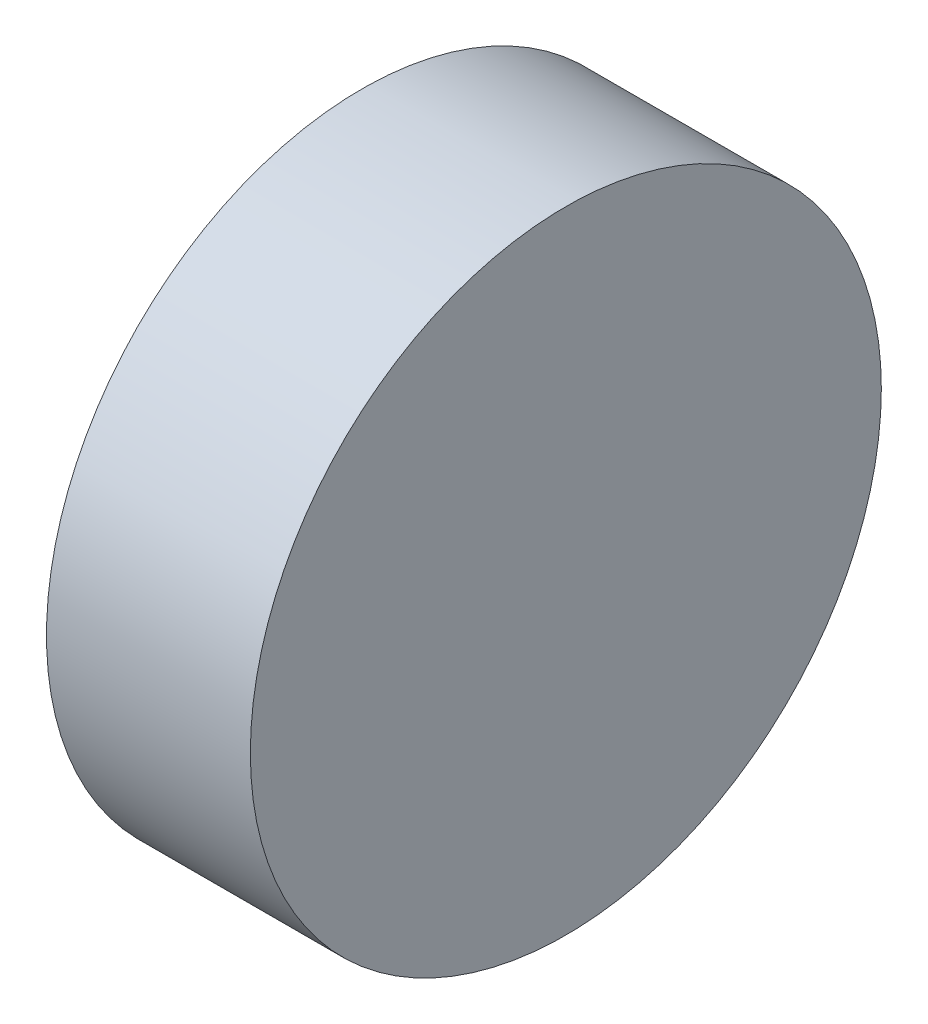
ISO-10303-21;
HEADER;
FILE_DESCRIPTION(('STEP AP214'),'2;1');
FILE_NAME('part.step','',(''),(''),'','','');
FILE_SCHEMA(('AUTOMOTIVE_DESIGN { 1 0 10303 214 1 1 1 1 }'));
ENDSEC;
DATA;
#1=APPLICATION_CONTEXT('core data for automotive mechanical design processes');
#2=APPLICATION_PROTOCOL_DEFINITION('international standard','automotive_design',2000,#1);
#3=PRODUCT_CONTEXT('',#1,'mechanical');
#4=PRODUCT('Part','Part','',(#3));
#5=PRODUCT_RELATED_PRODUCT_CATEGORY('part','',(#4));
#6=PRODUCT_DEFINITION_FORMATION('','',#4);
#7=PRODUCT_DEFINITION_CONTEXT('part definition',#1,'design');
#8=PRODUCT_DEFINITION('design','',#6,#7);
#9=PRODUCT_DEFINITION_SHAPE('','',#8);
#10=(LENGTH_UNIT() NAMED_UNIT(*) SI_UNIT(.MILLI.,.METRE.));
#11=(NAMED_UNIT(*) PLANE_ANGLE_UNIT() SI_UNIT($,.RADIAN.));
#12=(NAMED_UNIT(*) SI_UNIT($,.STERADIAN.) SOLID_ANGLE_UNIT());
#13=UNCERTAINTY_MEASURE_WITH_UNIT(LENGTH_MEASURE(1.E-05),#10,'distance_accuracy_value','');
#14=(GEOMETRIC_REPRESENTATION_CONTEXT(3) GLOBAL_UNCERTAINTY_ASSIGNED_CONTEXT((#13)) GLOBAL_UNIT_ASSIGNED_CONTEXT((#10,
#11,#12)) REPRESENTATION_CONTEXT('',''));
#15=CARTESIAN_POINT('',(0.,0.,0.));
#16=DIRECTION('',(0.,0.,1.));
#17=DIRECTION('',(1.,0.,0.));
#18=AXIS2_PLACEMENT_3D('',#15,#16,#17);
#19=CARTESIAN_POINT('',(4.2,0.,0.));
#20=DIRECTION('',(1.,0.,0.));
#21=DIRECTION('',(0.,0.,-1.));
#22=AXIS2_PLACEMENT_3D('',#19,#20,#21);
#23=PLANE('',#22);
#24=CARTESIAN_POINT('',(4.2,0.,0.));
#25=DIRECTION('',(-1.,0.,0.));
#26=DIRECTION('',(0.,0.,1.));
#27=AXIS2_PLACEMENT_3D('',#24,#25,#26);
#28=CIRCLE('',#27,13.);
#29=CARTESIAN_POINT('',(4.2,0.,13.));
#30=VERTEX_POINT('',#29);
#31=EDGE_CURVE('E88',#30,#30,#28,.T.);
#32=ORIENTED_EDGE('',*,*,#31,.F.);
#33=EDGE_LOOP('',(#32));
#34=FACE_BOUND('',#33,.T.);
#35=ADVANCED_FACE('F16',(#34),#23,.T.);
#36=CARTESIAN_POINT('',(-4.2,0.,0.));
#37=DIRECTION('',(-1.,0.,0.));
#38=DIRECTION('',(0.,0.,1.));
#39=AXIS2_PLACEMENT_3D('',#36,#37,#38);
#40=PLANE('',#39);
#41=CARTESIAN_POINT('',(-4.2,0.,0.));
#42=DIRECTION('',(1.,0.,0.));
#43=DIRECTION('',(0.,0.,-1.));
#44=AXIS2_PLACEMENT_3D('',#41,#42,#43);
#45=CIRCLE('',#44,13.);
#46=CARTESIAN_POINT('',(-4.2,0.,-13.));
#47=VERTEX_POINT('',#46);
#48=EDGE_CURVE('E85',#47,#47,#45,.T.);
#49=ORIENTED_EDGE('',*,*,#48,.F.);
#50=EDGE_LOOP('',(#49));
#51=FACE_BOUND('',#50,.T.);
#52=ADVANCED_FACE('F107',(#51),#40,.T.);
#53=CARTESIAN_POINT('',(-4.2,0.,0.));
#54=DIRECTION('',(1.,0.,0.));
#55=DIRECTION('',(0.,0.,-1.));
#56=AXIS2_PLACEMENT_3D('',#53,#54,#55);
#57=CYLINDRICAL_SURFACE('',#56,13.);
#58=DIRECTION('',(1.,0.,0.));
#59=VECTOR('',#58,1.);
#60=CARTESIAN_POINT('',(-4.2,-10.0876161703348,8.2));
#61=LINE('',#60,#59);
#62=CARTESIAN_POINT('',(3.2,-10.0876161703348,8.2));
#63=VERTEX_POINT('',#62);
#64=CARTESIAN_POINT('',(-3.2,-10.0876161703348,8.2));
#65=VERTEX_POINT('',#64);
#66=EDGE_CURVE('E10',#63,#65,#61,.F.);
#67=ORIENTED_EDGE('',*,*,#66,.F.);
#68=CARTESIAN_POINT('',(3.2,0.,0.));
#69=DIRECTION('',(1.,0.,0.));
#70=DIRECTION('',(0.,0.,-1.));
#71=AXIS2_PLACEMENT_3D('',#68,#69,#70);
#72=CIRCLE('',#71,13.);
#73=CARTESIAN_POINT('',(3.2,-10.0876161703348,-8.2));
#74=VERTEX_POINT('',#73);
#75=EDGE_CURVE('E91',#74,#63,#72,.F.);
#76=ORIENTED_EDGE('',*,*,#75,.F.);
#77=DIRECTION('',(1.,0.,0.));
#78=VECTOR('',#77,1.);
#79=CARTESIAN_POINT('',(-4.2,-10.0876161703348,-8.2));
#80=LINE('',#79,#78);
#81=CARTESIAN_POINT('',(-3.2,-10.0876161703348,-8.2));
#82=VERTEX_POINT('',#81);
#83=EDGE_CURVE('E61',#82,#74,#80,.T.);
#84=ORIENTED_EDGE('',*,*,#83,.F.);
#85=CARTESIAN_POINT('',(-3.2,0.,0.));
#86=DIRECTION('',(-1.,0.,0.));
#87=DIRECTION('',(0.,0.,1.));
#88=AXIS2_PLACEMENT_3D('',#85,#86,#87);
#89=CIRCLE('',#88,13.);
#90=EDGE_CURVE('E24',#65,#82,#89,.F.);
#91=ORIENTED_EDGE('',*,*,#90,.F.);
#92=EDGE_LOOP('',(#67,#76,#84,#91));
#93=FACE_BOUND('',#92,.T.);
#94=ORIENTED_EDGE('',*,*,#31,.T.);
#95=EDGE_LOOP('',(#94));
#96=FACE_BOUND('',#95,.T.);
#97=ORIENTED_EDGE('',*,*,#48,.T.);
#98=EDGE_LOOP('',(#97));
#99=FACE_BOUND('',#98,.T.);
#100=ADVANCED_FACE('F18',(#93,#96,#99),#57,.T.);
#101=CARTESIAN_POINT('',(0.,-10.25,8.2));
#102=DIRECTION('',(0.,0.,1.));
#103=DIRECTION('',(1.,0.,0.));
#104=AXIS2_PLACEMENT_3D('',#101,#102,#103);
#105=PLANE('',#104);
#106=ORIENTED_EDGE('',*,*,#66,.T.);
#107=DIRECTION('',(0.,1.,0.));
#108=VECTOR('',#107,1.);
#109=CARTESIAN_POINT('',(-3.2,-10.25,8.2));
#110=LINE('',#109,#108);
#111=CARTESIAN_POINT('',(-3.2,-7.,8.2));
#112=VERTEX_POINT('',#111);
#113=EDGE_CURVE('E83',#65,#112,#110,.T.);
#114=ORIENTED_EDGE('',*,*,#113,.T.);
#115=DIRECTION('',(1.,0.,0.));
#116=VECTOR('',#115,1.);
#117=CARTESIAN_POINT('',(0.,-7.,8.2));
#118=LINE('',#117,#116);
#119=CARTESIAN_POINT('',(3.2,-7.,8.2));
#120=VERTEX_POINT('',#119);
#121=EDGE_CURVE('E81',#112,#120,#118,.T.);
#122=ORIENTED_EDGE('',*,*,#121,.T.);
#123=DIRECTION('',(0.,-1.,0.));
#124=VECTOR('',#123,1.);
#125=CARTESIAN_POINT('',(3.2,-10.25,8.2));
#126=LINE('',#125,#124);
#127=EDGE_CURVE('E68',#120,#63,#126,.T.);
#128=ORIENTED_EDGE('',*,*,#127,.T.);
#129=EDGE_LOOP('',(#106,#114,#122,#128));
#130=FACE_BOUND('',#129,.T.);
#131=ADVANCED_FACE('F98',(#130),#105,.F.);
#132=CARTESIAN_POINT('',(-3.2,-10.25,-8.2));
#133=DIRECTION('',(-1.,0.,0.));
#134=DIRECTION('',(0.,0.,1.));
#135=AXIS2_PLACEMENT_3D('',#132,#133,#134);
#136=PLANE('',#135);
#137=ORIENTED_EDGE('',*,*,#90,.T.);
#138=DIRECTION('',(0.,-1.,0.));
#139=VECTOR('',#138,1.);
#140=CARTESIAN_POINT('',(-3.2,-10.25,-8.2));
#141=LINE('',#140,#139);
#142=CARTESIAN_POINT('',(-3.2,-7.,-8.2));
#143=VERTEX_POINT('',#142);
#144=EDGE_CURVE('E75',#143,#82,#141,.T.);
#145=ORIENTED_EDGE('',*,*,#144,.F.);
#146=DIRECTION('',(0.,0.,1.));
#147=VECTOR('',#146,1.);
#148=CARTESIAN_POINT('',(-3.2,-7.,-8.2));
#149=LINE('',#148,#147);
#150=EDGE_CURVE('E71',#143,#112,#149,.T.);
#151=ORIENTED_EDGE('',*,*,#150,.T.);
#152=ORIENTED_EDGE('',*,*,#113,.F.);
#153=EDGE_LOOP('',(#137,#145,#151,#152));
#154=FACE_BOUND('',#153,.T.);
#155=ADVANCED_FACE('F95',(#154),#136,.F.);
#156=CARTESIAN_POINT('',(0.,-7.,-8.2));
#157=DIRECTION('',(0.,1.,0.));
#158=DIRECTION('',(0.,0.,1.));
#159=AXIS2_PLACEMENT_3D('',#156,#157,#158);
#160=PLANE('',#159);
#161=ORIENTED_EDGE('',*,*,#150,.F.);
#162=DIRECTION('',(-1.,0.,0.));
#163=VECTOR('',#162,1.);
#164=CARTESIAN_POINT('',(0.,-7.,-8.2));
#165=LINE('',#164,#163);
#166=CARTESIAN_POINT('',(3.2,-7.,-8.2));
#167=VERTEX_POINT('',#166);
#168=EDGE_CURVE('E58',#167,#143,#165,.T.);
#169=ORIENTED_EDGE('',*,*,#168,.F.);
#170=DIRECTION('',(0.,0.,1.));
#171=VECTOR('',#170,1.);
#172=CARTESIAN_POINT('',(3.2,-7.,-8.2));
#173=LINE('',#172,#171);
#174=EDGE_CURVE('E63',#167,#120,#173,.T.);
#175=ORIENTED_EDGE('',*,*,#174,.T.);
#176=ORIENTED_EDGE('',*,*,#121,.F.);
#177=EDGE_LOOP('',(#161,#169,#175,#176));
#178=FACE_BOUND('',#177,.T.);
#179=ADVANCED_FACE('F73',(#178),#160,.F.);
#180=CARTESIAN_POINT('',(0.,-10.25,-8.2));
#181=DIRECTION('',(0.,0.,-1.));
#182=DIRECTION('',(-1.,0.,0.));
#183=AXIS2_PLACEMENT_3D('',#180,#181,#182);
#184=PLANE('',#183);
#185=ORIENTED_EDGE('',*,*,#83,.T.);
#186=DIRECTION('',(0.,1.,0.));
#187=VECTOR('',#186,1.);
#188=CARTESIAN_POINT('',(3.2,-10.25,-8.2));
#189=LINE('',#188,#187);
#190=EDGE_CURVE('E31',#74,#167,#189,.T.);
#191=ORIENTED_EDGE('',*,*,#190,.T.);
#192=ORIENTED_EDGE('',*,*,#168,.T.);
#193=ORIENTED_EDGE('',*,*,#144,.T.);
#194=EDGE_LOOP('',(#185,#191,#192,#193));
#195=FACE_BOUND('',#194,.T.);
#196=ADVANCED_FACE('F55',(#195),#184,.F.);
#197=CARTESIAN_POINT('',(3.2,-10.25,-8.2));
#198=DIRECTION('',(1.,0.,0.));
#199=DIRECTION('',(0.,0.,-1.));
#200=AXIS2_PLACEMENT_3D('',#197,#198,#199);
#201=PLANE('',#200);
#202=ORIENTED_EDGE('',*,*,#75,.T.);
#203=ORIENTED_EDGE('',*,*,#127,.F.);
#204=ORIENTED_EDGE('',*,*,#174,.F.);
#205=ORIENTED_EDGE('',*,*,#190,.F.);
#206=EDGE_LOOP('',(#202,#203,#204,#205));
#207=FACE_BOUND('',#206,.T.);
#208=ADVANCED_FACE('F67',(#207),#201,.F.);
#209=CLOSED_SHELL('',(#35,#52,#100,#131,#155,#179,#196,#208));
#210=MANIFOLD_SOLID_BREP('B1',#209);
#211=ADVANCED_BREP_SHAPE_REPRESENTATION('',(#18,#210),#14);
#212=SHAPE_DEFINITION_REPRESENTATION(#9,#211);
ENDSEC;
END-ISO-10303-21;
